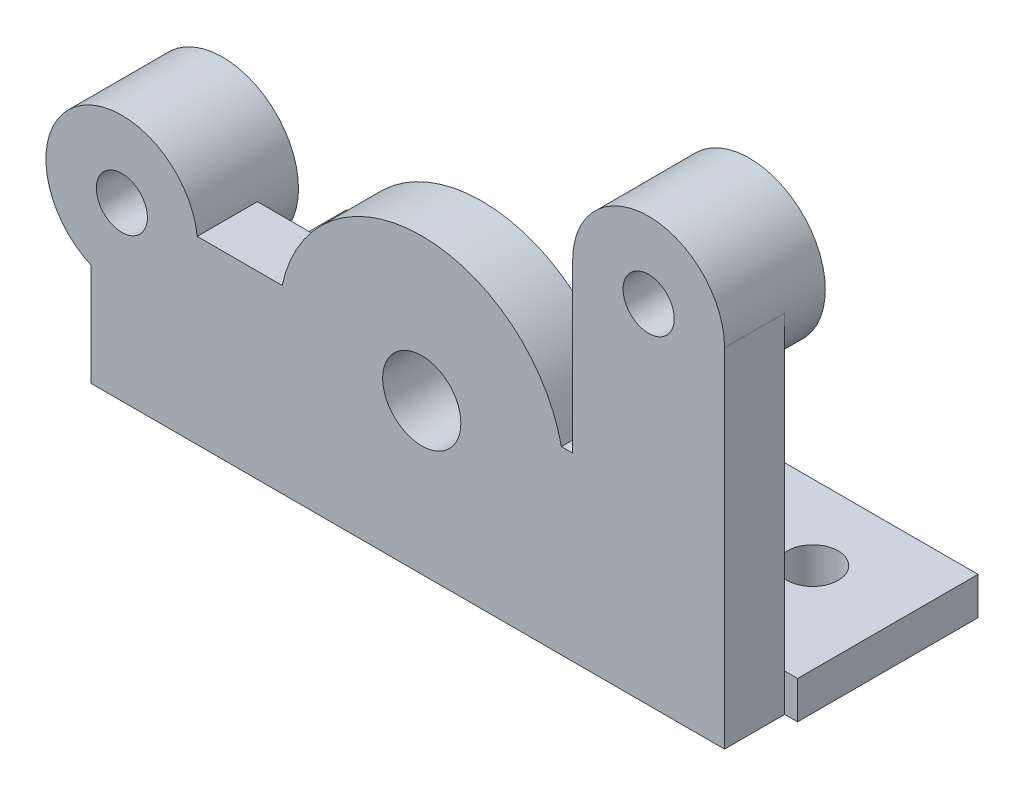
ISO-10303-21;
HEADER;
FILE_DESCRIPTION(('STEP AP214'),'2;1');
FILE_NAME('part.step','',(''),(''),'','','');
FILE_SCHEMA(('AUTOMOTIVE_DESIGN { 1 0 10303 214 1 1 1 1 }'));
ENDSEC;
DATA;
#1=APPLICATION_CONTEXT('core data for automotive mechanical design processes');
#2=APPLICATION_PROTOCOL_DEFINITION('international standard','automotive_design',2000,#1);
#3=PRODUCT_CONTEXT('',#1,'mechanical');
#4=PRODUCT('Part','Part','',(#3));
#5=PRODUCT_RELATED_PRODUCT_CATEGORY('part','',(#4));
#6=PRODUCT_DEFINITION_FORMATION('','',#4);
#7=PRODUCT_DEFINITION_CONTEXT('part definition',#1,'design');
#8=PRODUCT_DEFINITION('design','',#6,#7);
#9=PRODUCT_DEFINITION_SHAPE('','',#8);
#10=(LENGTH_UNIT() NAMED_UNIT(*) SI_UNIT(.MILLI.,.METRE.));
#11=(NAMED_UNIT(*) PLANE_ANGLE_UNIT() SI_UNIT($,.RADIAN.));
#12=(NAMED_UNIT(*) SI_UNIT($,.STERADIAN.) SOLID_ANGLE_UNIT());
#13=UNCERTAINTY_MEASURE_WITH_UNIT(LENGTH_MEASURE(1.E-05),#10,'distance_accuracy_value','');
#14=(GEOMETRIC_REPRESENTATION_CONTEXT(3) GLOBAL_UNCERTAINTY_ASSIGNED_CONTEXT((#13)) GLOBAL_UNIT_ASSIGNED_CONTEXT((#10,
#11,#12)) REPRESENTATION_CONTEXT('',''));
#15=CARTESIAN_POINT('',(0.,0.,0.));
#16=DIRECTION('',(0.,0.,1.));
#17=DIRECTION('',(1.,0.,0.));
#18=AXIS2_PLACEMENT_3D('',#15,#16,#17);
#19=CARTESIAN_POINT('',(315.090923202436,53.1249395007438,343.5));
#20=DIRECTION('',(0.,0.,1.));
#21=DIRECTION('',(1.,0.,0.));
#22=AXIS2_PLACEMENT_3D('',#19,#20,#21);
#23=PLANE('',#22);
#24=CARTESIAN_POINT('',(315.090923202436,53.1249395007438,343.5));
#25=DIRECTION('',(0.,0.,1.));
#26=DIRECTION('',(1.,0.,0.));
#27=AXIS2_PLACEMENT_3D('',#24,#25,#26);
#28=CIRCLE('',#27,5.05);
#29=CARTESIAN_POINT('',(310.040923202436,53.1249395007438,343.5));
#30=VERTEX_POINT('',#29);
#31=CARTESIAN_POINT('',(320.140923202436,53.1249395007438,343.5));
#32=VERTEX_POINT('',#31);
#33=EDGE_CURVE('E232',#30,#32,#28,.T.);
#34=ORIENTED_EDGE('',*,*,#33,.T.);
#35=DIRECTION('',(0.,1.,0.));
#36=VECTOR('',#35,1.);
#37=CARTESIAN_POINT('',(320.140923202436,30.,343.5));
#38=LINE('',#37,#36);
#39=CARTESIAN_POINT('',(320.140923202436,32.5,343.5));
#40=VERTEX_POINT('',#39);
#41=EDGE_CURVE('E210',#40,#32,#38,.T.);
#42=ORIENTED_EDGE('',*,*,#41,.F.);
#43=DIRECTION('',(1.,0.,0.));
#44=VECTOR('',#43,1.);
#45=CARTESIAN_POINT('',(321.,32.5,343.5));
#46=LINE('',#45,#44);
#47=CARTESIAN_POINT('',(279.,32.5,343.5));
#48=VERTEX_POINT('',#47);
#49=EDGE_CURVE('E265',#48,#40,#46,.T.);
#50=ORIENTED_EDGE('',*,*,#49,.F.);
#51=DIRECTION('',(0.,-1.,0.));
#52=VECTOR('',#51,1.);
#53=CARTESIAN_POINT('',(279.,32.5,343.5));
#54=LINE('',#53,#52);
#55=CARTESIAN_POINT('',(279.,30.,343.5));
#56=VERTEX_POINT('',#55);
#57=EDGE_CURVE('E241',#48,#56,#54,.T.);
#58=ORIENTED_EDGE('',*,*,#57,.T.);
#59=DIRECTION('',(1.,0.,0.));
#60=VECTOR('',#59,1.);
#61=CARTESIAN_POINT('',(310.040923202436,30.,343.5));
#62=LINE('',#61,#60);
#63=CARTESIAN_POINT('',(278.,30.,343.5));
#64=VERTEX_POINT('',#63);
#65=EDGE_CURVE('E207',#64,#56,#62,.T.);
#66=ORIENTED_EDGE('',*,*,#65,.F.);
#67=DIRECTION('',(0.,-1.,0.));
#68=VECTOR('',#67,1.);
#69=CARTESIAN_POINT('',(278.,42.,343.5));
#70=LINE('',#69,#68);
#71=CARTESIAN_POINT('',(278.,36.8075323812111,343.5));
#72=VERTEX_POINT('',#71);
#73=EDGE_CURVE('E144',#72,#64,#70,.T.);
#74=ORIENTED_EDGE('',*,*,#73,.F.);
#75=CARTESIAN_POINT('',(280.050647311647,41.4224371043051,343.5));
#76=DIRECTION('',(0.,0.,1.));
#77=DIRECTION('',(1.,0.,0.));
#78=AXIS2_PLACEMENT_3D('',#75,#76,#77);
#79=CIRCLE('',#78,5.05);
#80=CARTESIAN_POINT('',(285.067510983456,42.,343.5));
#81=VERTEX_POINT('',#80);
#82=EDGE_CURVE('E138',#72,#81,#79,.T.);
#83=ORIENTED_EDGE('',*,*,#82,.T.);
#84=DIRECTION('',(-1.,0.,0.));
#85=VECTOR('',#84,1.);
#86=CARTESIAN_POINT('',(319.,42.,343.5));
#87=LINE('',#86,#85);
#88=CARTESIAN_POINT('',(290.712912189497,42.,343.5));
#89=VERTEX_POINT('',#88);
#90=EDGE_CURVE('E142',#89,#81,#87,.T.);
#91=ORIENTED_EDGE('',*,*,#90,.F.);
#92=CARTESIAN_POINT('',(300.,40.,343.5));
#93=DIRECTION('',(0.,0.,1.));
#94=DIRECTION('',(1.,0.,0.));
#95=AXIS2_PLACEMENT_3D('',#92,#93,#94);
#96=CIRCLE('',#95,9.50000000000001);
#97=CARTESIAN_POINT('',(309.287087810503,42.,343.5));
#98=VERTEX_POINT('',#97);
#99=EDGE_CURVE('E176',#98,#89,#96,.T.);
#100=ORIENTED_EDGE('',*,*,#99,.F.);
#101=CARTESIAN_POINT('',(310.040923202436,42.,343.5));
#102=VERTEX_POINT('',#101);
#103=EDGE_CURVE('E159',#102,#98,#87,.T.);
#104=ORIENTED_EDGE('',*,*,#103,.F.);
#105=DIRECTION('',(0.,-1.,0.));
#106=VECTOR('',#105,1.);
#107=CARTESIAN_POINT('',(310.040923202436,53.1249395007438,343.5));
#108=LINE('',#107,#106);
#109=EDGE_CURVE('E196',#30,#102,#108,.T.);
#110=ORIENTED_EDGE('',*,*,#109,.F.);
#111=EDGE_LOOP('',(#34,#42,#50,#58,#66,#74,#83,#91,#100,#104,#110));
#112=FACE_BOUND('',#111,.T.);
#113=CARTESIAN_POINT('',(300.,40.,343.5));
#114=DIRECTION('',(0.,0.,1.));
#115=DIRECTION('',(1.,0.,0.));
#116=AXIS2_PLACEMENT_3D('',#113,#114,#115);
#117=CIRCLE('',#116,2.59999999999999);
#118=CARTESIAN_POINT('',(302.6,40.,343.5));
#119=VERTEX_POINT('',#118);
#120=EDGE_CURVE('E166',#119,#119,#117,.T.);
#121=ORIENTED_EDGE('',*,*,#120,.T.);
#122=EDGE_LOOP('',(#121));
#123=FACE_BOUND('',#122,.T.);
#124=ADVANCED_FACE('F39',(#112,#123),#23,.F.);
#125=CARTESIAN_POINT('',(310.040923202436,53.1249395007438,347.5));
#126=DIRECTION('',(1.,0.,0.));
#127=DIRECTION('',(0.,0.,-1.));
#128=AXIS2_PLACEMENT_3D('',#125,#126,#127);
#129=PLANE('',#128);
#130=DIRECTION('',(0.,0.,-1.));
#131=VECTOR('',#130,1.);
#132=CARTESIAN_POINT('',(310.040923202436,42.,347.5));
#133=LINE('',#132,#131);
#134=CARTESIAN_POINT('',(310.040923202436,42.,347.5));
#135=VERTEX_POINT('',#134);
#136=EDGE_CURVE('E11',#135,#102,#133,.T.);
#137=ORIENTED_EDGE('',*,*,#136,.F.);
#138=DIRECTION('',(0.,-1.,0.));
#139=VECTOR('',#138,1.);
#140=CARTESIAN_POINT('',(310.040923202436,53.1249395007438,347.5));
#141=LINE('',#140,#139);
#142=CARTESIAN_POINT('',(310.040923202436,53.1249395007438,347.5));
#143=VERTEX_POINT('',#142);
#144=EDGE_CURVE('E197',#143,#135,#141,.T.);
#145=ORIENTED_EDGE('',*,*,#144,.F.);
#146=DIRECTION('',(0.,0.,-1.));
#147=VECTOR('',#146,1.);
#148=CARTESIAN_POINT('',(310.040923202436,53.1249395007438,347.5));
#149=LINE('',#148,#147);
#150=EDGE_CURVE('E205',#143,#30,#149,.T.);
#151=ORIENTED_EDGE('',*,*,#150,.T.);
#152=ORIENTED_EDGE('',*,*,#109,.T.);
#153=EDGE_LOOP('',(#137,#145,#151,#152));
#154=FACE_BOUND('',#153,.T.);
#155=ADVANCED_FACE('F228',(#154),#129,.F.);
#156=CARTESIAN_POINT('',(315.090923202436,53.1249395007438,347.5));
#157=DIRECTION('',(0.,0.,-1.));
#158=DIRECTION('',(-1.,0.,0.));
#159=AXIS2_PLACEMENT_3D('',#156,#157,#158);
#160=CYLINDRICAL_SURFACE('',#159,5.05);
#161=ORIENTED_EDGE('',*,*,#150,.F.);
#162=CARTESIAN_POINT('',(315.090923202436,53.1249395007438,347.5));
#163=DIRECTION('',(0.,0.,1.));
#164=DIRECTION('',(1.,0.,0.));
#165=AXIS2_PLACEMENT_3D('',#162,#163,#164);
#166=CIRCLE('',#165,5.05);
#167=CARTESIAN_POINT('',(320.140923202436,53.1249395007438,347.5));
#168=VERTEX_POINT('',#167);
#169=EDGE_CURVE('E47',#168,#143,#166,.T.);
#170=ORIENTED_EDGE('',*,*,#169,.F.);
#171=DIRECTION('',(0.,0.,-1.));
#172=VECTOR('',#171,1.);
#173=CARTESIAN_POINT('',(320.140923202436,53.1249395007438,347.5));
#174=LINE('',#173,#172);
#175=EDGE_CURVE('E215',#168,#32,#174,.T.);
#176=ORIENTED_EDGE('',*,*,#175,.T.);
#177=ORIENTED_EDGE('',*,*,#33,.F.);
#178=EDGE_LOOP('',(#161,#170,#176,#177));
#179=FACE_BOUND('',#178,.T.);
#180=CARTESIAN_POINT('',(315.090923202436,53.1249395007438,340.8));
#181=DIRECTION('',(0.,0.,1.));
#182=DIRECTION('',(1.,0.,0.));
#183=AXIS2_PLACEMENT_3D('',#180,#181,#182);
#184=CIRCLE('',#183,5.05);
#185=CARTESIAN_POINT('',(320.140923202436,53.1249395007438,340.8));
#186=VERTEX_POINT('',#185);
#187=EDGE_CURVE('E283',#186,#186,#184,.T.);
#188=ORIENTED_EDGE('',*,*,#187,.T.);
#189=EDGE_LOOP('',(#188));
#190=FACE_BOUND('',#189,.T.);
#191=ADVANCED_FACE('F41',(#179,#190),#160,.T.);
#192=CARTESIAN_POINT('',(315.090923202436,53.1249395007438,347.5));
#193=DIRECTION('',(0.,0.,1.));
#194=DIRECTION('',(1.,0.,0.));
#195=AXIS2_PLACEMENT_3D('',#192,#193,#194);
#196=PLANE('',#195);
#197=CARTESIAN_POINT('',(315.090923202436,53.1249395007438,347.5));
#198=DIRECTION('',(0.,0.,1.));
#199=DIRECTION('',(1.,0.,0.));
#200=AXIS2_PLACEMENT_3D('',#197,#198,#199);
#201=CIRCLE('',#200,1.69999999999998);
#202=CARTESIAN_POINT('',(313.390923202436,53.1249395007438,347.5));
#203=VERTEX_POINT('',#202);
#204=EDGE_CURVE('E150',#203,#203,#201,.T.);
#205=ORIENTED_EDGE('',*,*,#204,.F.);
#206=EDGE_LOOP('',(#205));
#207=FACE_BOUND('',#206,.T.);
#208=CARTESIAN_POINT('',(280.050647311647,41.4224371043051,347.5));
#209=DIRECTION('',(0.,0.,1.));
#210=DIRECTION('',(1.,0.,0.));
#211=AXIS2_PLACEMENT_3D('',#208,#209,#210);
#212=CIRCLE('',#211,1.69999999999998);
#213=CARTESIAN_POINT('',(278.350647311647,41.4224371043051,347.5));
#214=VERTEX_POINT('',#213);
#215=EDGE_CURVE('E287',#214,#214,#212,.T.);
#216=ORIENTED_EDGE('',*,*,#215,.F.);
#217=EDGE_LOOP('',(#216));
#218=FACE_BOUND('',#217,.T.);
#219=ORIENTED_EDGE('',*,*,#144,.T.);
#220=DIRECTION('',(-1.,0.,0.));
#221=VECTOR('',#220,1.);
#222=CARTESIAN_POINT('',(319.,42.,347.5));
#223=LINE('',#222,#221);
#224=CARTESIAN_POINT('',(309.287087810503,42.,347.5));
#225=VERTEX_POINT('',#224);
#226=EDGE_CURVE('E190',#135,#225,#223,.T.);
#227=ORIENTED_EDGE('',*,*,#226,.T.);
#228=CARTESIAN_POINT('',(300.,40.,347.5));
#229=DIRECTION('',(0.,0.,1.));
#230=DIRECTION('',(1.,0.,0.));
#231=AXIS2_PLACEMENT_3D('',#228,#229,#230);
#232=CIRCLE('',#231,9.50000000000001);
#233=CARTESIAN_POINT('',(290.712912189497,42.,347.5));
#234=VERTEX_POINT('',#233);
#235=EDGE_CURVE('E178',#225,#234,#232,.T.);
#236=ORIENTED_EDGE('',*,*,#235,.T.);
#237=CARTESIAN_POINT('',(285.067510983456,42.,347.5));
#238=VERTEX_POINT('',#237);
#239=EDGE_CURVE('E189',#234,#238,#223,.T.);
#240=ORIENTED_EDGE('',*,*,#239,.T.);
#241=CARTESIAN_POINT('',(280.050647311647,41.4224371043051,347.5));
#242=DIRECTION('',(0.,0.,1.));
#243=DIRECTION('',(1.,0.,0.));
#244=AXIS2_PLACEMENT_3D('',#241,#242,#243);
#245=CIRCLE('',#244,5.05);
#246=CARTESIAN_POINT('',(278.,36.8075323812111,347.5));
#247=VERTEX_POINT('',#246);
#248=EDGE_CURVE('E165',#238,#247,#245,.T.);
#249=ORIENTED_EDGE('',*,*,#248,.T.);
#250=DIRECTION('',(0.,-1.,0.));
#251=VECTOR('',#250,1.);
#252=CARTESIAN_POINT('',(278.,42.,347.5));
#253=LINE('',#252,#251);
#254=CARTESIAN_POINT('',(278.,30.,347.5));
#255=VERTEX_POINT('',#254);
#256=EDGE_CURVE('E186',#247,#255,#253,.T.);
#257=ORIENTED_EDGE('',*,*,#256,.T.);
#258=DIRECTION('',(1.,0.,0.));
#259=VECTOR('',#258,1.);
#260=CARTESIAN_POINT('',(310.040923202436,30.,347.5));
#261=LINE('',#260,#259);
#262=CARTESIAN_POINT('',(320.140923202436,30.,347.5));
#263=VERTEX_POINT('',#262);
#264=EDGE_CURVE('E199',#255,#263,#261,.T.);
#265=ORIENTED_EDGE('',*,*,#264,.T.);
#266=DIRECTION('',(0.,1.,0.));
#267=VECTOR('',#266,1.);
#268=CARTESIAN_POINT('',(320.140923202436,30.,347.5));
#269=LINE('',#268,#267);
#270=EDGE_CURVE('E202',#263,#168,#269,.T.);
#271=ORIENTED_EDGE('',*,*,#270,.T.);
#272=ORIENTED_EDGE('',*,*,#169,.T.);
#273=EDGE_LOOP('',(#219,#227,#236,#240,#249,#257,#265,#271,#272));
#274=FACE_BOUND('',#273,.T.);
#275=CARTESIAN_POINT('',(300.,40.,347.5));
#276=DIRECTION('',(0.,0.,1.));
#277=DIRECTION('',(1.,0.,0.));
#278=AXIS2_PLACEMENT_3D('',#275,#276,#277);
#279=CIRCLE('',#278,2.59999999999999);
#280=CARTESIAN_POINT('',(302.6,40.,347.5));
#281=VERTEX_POINT('',#280);
#282=EDGE_CURVE('E170',#281,#281,#279,.T.);
#283=ORIENTED_EDGE('',*,*,#282,.F.);
#284=EDGE_LOOP('',(#283));
#285=FACE_BOUND('',#284,.T.);
#286=ADVANCED_FACE('F222',(#207,#218,#274,#285),#196,.T.);
#287=CARTESIAN_POINT('',(310.040923202436,30.,347.5));
#288=DIRECTION('',(0.,1.,0.));
#289=DIRECTION('',(0.,0.,1.));
#290=AXIS2_PLACEMENT_3D('',#287,#288,#289);
#291=PLANE('',#290);
#292=ORIENTED_EDGE('',*,*,#65,.T.);
#293=DIRECTION('',(0.,0.,1.));
#294=VECTOR('',#293,1.);
#295=CARTESIAN_POINT('',(279.,30.,343.5));
#296=LINE('',#295,#294);
#297=CARTESIAN_POINT('',(279.,30.,331.5));
#298=VERTEX_POINT('',#297);
#299=EDGE_CURVE('E54',#298,#56,#296,.T.);
#300=ORIENTED_EDGE('',*,*,#299,.F.);
#301=DIRECTION('',(-1.,0.,0.));
#302=VECTOR('',#301,1.);
#303=CARTESIAN_POINT('',(279.,30.,331.5));
#304=LINE('',#303,#302);
#305=CARTESIAN_POINT('',(321.,30.,331.5));
#306=VERTEX_POINT('',#305);
#307=EDGE_CURVE('E253',#306,#298,#304,.T.);
#308=ORIENTED_EDGE('',*,*,#307,.F.);
#309=DIRECTION('',(0.,0.,-1.));
#310=VECTOR('',#309,1.);
#311=CARTESIAN_POINT('',(321.,30.,331.5));
#312=LINE('',#311,#310);
#313=CARTESIAN_POINT('',(321.,30.,343.5));
#314=VERTEX_POINT('',#313);
#315=EDGE_CURVE('E256',#314,#306,#312,.T.);
#316=ORIENTED_EDGE('',*,*,#315,.F.);
#317=DIRECTION('',(1.,0.,0.));
#318=VECTOR('',#317,1.);
#319=CARTESIAN_POINT('',(321.,30.,343.5));
#320=LINE('',#319,#318);
#321=CARTESIAN_POINT('',(320.140923202436,30.,343.5));
#322=VERTEX_POINT('',#321);
#323=EDGE_CURVE('E258',#322,#314,#320,.T.);
#324=ORIENTED_EDGE('',*,*,#323,.F.);
#325=DIRECTION('',(0.,0.,-1.));
#326=VECTOR('',#325,1.);
#327=CARTESIAN_POINT('',(320.140923202436,30.,347.5));
#328=LINE('',#327,#326);
#329=EDGE_CURVE('E218',#263,#322,#328,.T.);
#330=ORIENTED_EDGE('',*,*,#329,.F.);
#331=ORIENTED_EDGE('',*,*,#264,.F.);
#332=DIRECTION('',(0.,0.,-1.));
#333=VECTOR('',#332,1.);
#334=CARTESIAN_POINT('',(278.,30.,347.5));
#335=LINE('',#334,#333);
#336=EDGE_CURVE('E192',#255,#64,#335,.T.);
#337=ORIENTED_EDGE('',*,*,#336,.T.);
#338=EDGE_LOOP('',(#292,#300,#308,#316,#324,#330,#331,#337));
#339=FACE_BOUND('',#338,.T.);
#340=CARTESIAN_POINT('',(285.,30.,336.5));
#341=DIRECTION('',(0.,1.,0.));
#342=DIRECTION('',(0.,0.,1.));
#343=AXIS2_PLACEMENT_3D('',#340,#341,#342);
#344=CIRCLE('',#343,1.69999999999998);
#345=CARTESIAN_POINT('',(285.,30.,338.2));
#346=VERTEX_POINT('',#345);
#347=EDGE_CURVE('E270',#346,#346,#344,.T.);
#348=ORIENTED_EDGE('',*,*,#347,.T.);
#349=EDGE_LOOP('',(#348));
#350=FACE_BOUND('',#349,.T.);
#351=CARTESIAN_POINT('',(315.,30.,336.5));
#352=DIRECTION('',(0.,1.,0.));
#353=DIRECTION('',(0.,0.,1.));
#354=AXIS2_PLACEMENT_3D('',#351,#352,#353);
#355=CIRCLE('',#354,1.69999999999998);
#356=CARTESIAN_POINT('',(315.,30.,338.2));
#357=VERTEX_POINT('',#356);
#358=EDGE_CURVE('E276',#357,#357,#355,.T.);
#359=ORIENTED_EDGE('',*,*,#358,.T.);
#360=EDGE_LOOP('',(#359));
#361=FACE_BOUND('',#360,.T.);
#362=ADVANCED_FACE('F304',(#339,#350,#361),#291,.F.);
#363=CARTESIAN_POINT('',(320.140923202436,30.,347.5));
#364=DIRECTION('',(-1.,0.,0.));
#365=DIRECTION('',(0.,0.,1.));
#366=AXIS2_PLACEMENT_3D('',#363,#364,#365);
#367=PLANE('',#366);
#368=EDGE_CURVE('E200',#322,#40,#38,.T.);
#369=ORIENTED_EDGE('',*,*,#368,.T.);
#370=ORIENTED_EDGE('',*,*,#41,.T.);
#371=ORIENTED_EDGE('',*,*,#175,.F.);
#372=ORIENTED_EDGE('',*,*,#270,.F.);
#373=ORIENTED_EDGE('',*,*,#329,.T.);
#374=EDGE_LOOP('',(#369,#370,#371,#372,#373));
#375=FACE_BOUND('',#374,.T.);
#376=ADVANCED_FACE('F344',(#375),#367,.F.);
#377=CARTESIAN_POINT('',(319.,42.,347.5));
#378=DIRECTION('',(0.,-1.,0.));
#379=DIRECTION('',(0.,0.,-1.));
#380=AXIS2_PLACEMENT_3D('',#377,#378,#379);
#381=PLANE('',#380);
#382=ORIENTED_EDGE('',*,*,#226,.F.);
#383=ORIENTED_EDGE('',*,*,#136,.T.);
#384=ORIENTED_EDGE('',*,*,#103,.T.);
#385=DIRECTION('',(0.,0.,-1.));
#386=VECTOR('',#385,1.);
#387=CARTESIAN_POINT('',(309.287087810503,42.,347.5));
#388=LINE('',#387,#386);
#389=EDGE_CURVE('E181',#225,#98,#388,.T.);
#390=ORIENTED_EDGE('',*,*,#389,.F.);
#391=EDGE_LOOP('',(#382,#383,#384,#390));
#392=FACE_BOUND('',#391,.T.);
#393=ADVANCED_FACE('F236',(#392),#381,.F.);
#394=DIRECTION('',(0.,0.,-1.));
#395=VECTOR('',#394,1.);
#396=CARTESIAN_POINT('',(285.067510983456,42.,347.5));
#397=LINE('',#396,#395);
#398=EDGE_CURVE('E156',#238,#81,#397,.T.);
#399=ORIENTED_EDGE('',*,*,#398,.F.);
#400=ORIENTED_EDGE('',*,*,#239,.F.);
#401=DIRECTION('',(0.,0.,-1.));
#402=VECTOR('',#401,1.);
#403=CARTESIAN_POINT('',(290.712912189497,42.,347.5));
#404=LINE('',#403,#402);
#405=EDGE_CURVE('E158',#89,#234,#404,.F.);
#406=ORIENTED_EDGE('',*,*,#405,.F.);
#407=ORIENTED_EDGE('',*,*,#90,.T.);
#408=EDGE_LOOP('',(#399,#400,#406,#407));
#409=FACE_BOUND('',#408,.T.);
#410=ADVANCED_FACE('F154',(#409),#381,.F.);
#411=CARTESIAN_POINT('',(278.,42.,347.5));
#412=DIRECTION('',(1.,0.,0.));
#413=DIRECTION('',(0.,0.,-1.));
#414=AXIS2_PLACEMENT_3D('',#411,#412,#413);
#415=PLANE('',#414);
#416=DIRECTION('',(0.,0.,-1.));
#417=VECTOR('',#416,1.);
#418=CARTESIAN_POINT('',(278.,36.8075323812111,347.5));
#419=LINE('',#418,#417);
#420=EDGE_CURVE('E167',#72,#247,#419,.F.);
#421=ORIENTED_EDGE('',*,*,#420,.F.);
#422=ORIENTED_EDGE('',*,*,#73,.T.);
#423=ORIENTED_EDGE('',*,*,#336,.F.);
#424=ORIENTED_EDGE('',*,*,#256,.F.);
#425=EDGE_LOOP('',(#421,#422,#423,#424));
#426=FACE_BOUND('',#425,.T.);
#427=ADVANCED_FACE('F349',(#426),#415,.F.);
#428=CARTESIAN_POINT('',(300.,40.,347.5));
#429=DIRECTION('',(0.,0.,-1.));
#430=DIRECTION('',(-1.,0.,0.));
#431=AXIS2_PLACEMENT_3D('',#428,#429,#430);
#432=CYLINDRICAL_SURFACE('',#431,9.50000000000001);
#433=ORIENTED_EDGE('',*,*,#99,.T.);
#434=ORIENTED_EDGE('',*,*,#405,.T.);
#435=ORIENTED_EDGE('',*,*,#235,.F.);
#436=ORIENTED_EDGE('',*,*,#389,.T.);
#437=EDGE_LOOP('',(#433,#434,#435,#436));
#438=FACE_BOUND('',#437,.T.);
#439=ADVANCED_FACE('F239',(#438),#432,.T.);
#440=CARTESIAN_POINT('',(300.,40.,347.5));
#441=DIRECTION('',(0.,0.,-1.));
#442=DIRECTION('',(-1.,0.,0.));
#443=AXIS2_PLACEMENT_3D('',#440,#441,#442);
#444=CYLINDRICAL_SURFACE('',#443,2.59999999999999);
#445=ORIENTED_EDGE('',*,*,#282,.T.);
#446=EDGE_LOOP('',(#445));
#447=FACE_BOUND('',#446,.T.);
#448=ORIENTED_EDGE('',*,*,#120,.F.);
#449=EDGE_LOOP('',(#448));
#450=FACE_BOUND('',#449,.T.);
#451=ADVANCED_FACE('F323',(#447,#450),#444,.F.);
#452=CARTESIAN_POINT('',(280.050647311647,41.4224371043051,347.5));
#453=DIRECTION('',(0.,0.,-1.));
#454=DIRECTION('',(-1.,0.,0.));
#455=AXIS2_PLACEMENT_3D('',#452,#453,#454);
#456=CYLINDRICAL_SURFACE('',#455,5.05);
#457=ORIENTED_EDGE('',*,*,#248,.F.);
#458=ORIENTED_EDGE('',*,*,#398,.T.);
#459=ORIENTED_EDGE('',*,*,#82,.F.);
#460=ORIENTED_EDGE('',*,*,#420,.T.);
#461=EDGE_LOOP('',(#457,#458,#459,#460));
#462=FACE_BOUND('',#461,.T.);
#463=CARTESIAN_POINT('',(280.050647311647,41.4224371043051,340.8));
#464=DIRECTION('',(0.,0.,1.));
#465=DIRECTION('',(1.,0.,0.));
#466=AXIS2_PLACEMENT_3D('',#463,#464,#465);
#467=CIRCLE('',#466,5.05);
#468=CARTESIAN_POINT('',(285.100647311647,41.4224371043051,340.8));
#469=VERTEX_POINT('',#468);
#470=EDGE_CURVE('E149',#469,#469,#467,.T.);
#471=ORIENTED_EDGE('',*,*,#470,.T.);
#472=EDGE_LOOP('',(#471));
#473=FACE_BOUND('',#472,.T.);
#474=ADVANCED_FACE('F162',(#462,#473),#456,.T.);
#475=CARTESIAN_POINT('',(0.,32.5,0.));
#476=DIRECTION('',(0.,-1.,0.));
#477=DIRECTION('',(0.,0.,-1.));
#478=AXIS2_PLACEMENT_3D('',#475,#476,#477);
#479=PLANE('',#478);
#480=DIRECTION('',(0.,0.,1.));
#481=VECTOR('',#480,1.);
#482=CARTESIAN_POINT('',(279.,32.5,343.5));
#483=LINE('',#482,#481);
#484=CARTESIAN_POINT('',(279.,32.5,331.5));
#485=VERTEX_POINT('',#484);
#486=EDGE_CURVE('E255',#485,#48,#483,.T.);
#487=ORIENTED_EDGE('',*,*,#486,.T.);
#488=ORIENTED_EDGE('',*,*,#49,.T.);
#489=CARTESIAN_POINT('',(321.,32.5,343.5));
#490=VERTEX_POINT('',#489);
#491=EDGE_CURVE('E268',#40,#490,#46,.T.);
#492=ORIENTED_EDGE('',*,*,#491,.T.);
#493=DIRECTION('',(0.,0.,-1.));
#494=VECTOR('',#493,1.);
#495=CARTESIAN_POINT('',(321.,32.5,331.5));
#496=LINE('',#495,#494);
#497=CARTESIAN_POINT('',(321.,32.5,331.5));
#498=VERTEX_POINT('',#497);
#499=EDGE_CURVE('E263',#490,#498,#496,.T.);
#500=ORIENTED_EDGE('',*,*,#499,.T.);
#501=DIRECTION('',(-1.,0.,0.));
#502=VECTOR('',#501,1.);
#503=CARTESIAN_POINT('',(279.,32.5,331.5));
#504=LINE('',#503,#502);
#505=EDGE_CURVE('E252',#498,#485,#504,.T.);
#506=ORIENTED_EDGE('',*,*,#505,.T.);
#507=EDGE_LOOP('',(#487,#488,#492,#500,#506));
#508=FACE_BOUND('',#507,.T.);
#509=CARTESIAN_POINT('',(285.,32.5,336.5));
#510=DIRECTION('',(0.,1.,0.));
#511=DIRECTION('',(0.,0.,1.));
#512=AXIS2_PLACEMENT_3D('',#509,#510,#511);
#513=CIRCLE('',#512,1.69999999999998);
#514=CARTESIAN_POINT('',(285.,32.5,338.2));
#515=VERTEX_POINT('',#514);
#516=EDGE_CURVE('E261',#515,#515,#513,.T.);
#517=ORIENTED_EDGE('',*,*,#516,.F.);
#518=EDGE_LOOP('',(#517));
#519=FACE_BOUND('',#518,.T.);
#520=CARTESIAN_POINT('',(315.,32.5,336.5));
#521=DIRECTION('',(0.,1.,0.));
#522=DIRECTION('',(0.,0.,1.));
#523=AXIS2_PLACEMENT_3D('',#520,#521,#522);
#524=CIRCLE('',#523,1.69999999999998);
#525=CARTESIAN_POINT('',(315.,32.5,338.2));
#526=VERTEX_POINT('',#525);
#527=EDGE_CURVE('E273',#526,#526,#524,.T.);
#528=ORIENTED_EDGE('',*,*,#527,.F.);
#529=EDGE_LOOP('',(#528));
#530=FACE_BOUND('',#529,.T.);
#531=ADVANCED_FACE('F322',(#508,#519,#530),#479,.F.);
#532=CARTESIAN_POINT('',(279.,32.5,343.5));
#533=DIRECTION('',(1.,0.,0.));
#534=DIRECTION('',(0.,0.,-1.));
#535=AXIS2_PLACEMENT_3D('',#532,#533,#534);
#536=PLANE('',#535);
#537=ORIENTED_EDGE('',*,*,#299,.T.);
#538=ORIENTED_EDGE('',*,*,#57,.F.);
#539=ORIENTED_EDGE('',*,*,#486,.F.);
#540=DIRECTION('',(0.,-1.,0.));
#541=VECTOR('',#540,1.);
#542=CARTESIAN_POINT('',(279.,32.5,331.5));
#543=LINE('',#542,#541);
#544=EDGE_CURVE('E250',#485,#298,#543,.T.);
#545=ORIENTED_EDGE('',*,*,#544,.T.);
#546=EDGE_LOOP('',(#537,#538,#539,#545));
#547=FACE_BOUND('',#546,.T.);
#548=ADVANCED_FACE('F329',(#547),#536,.F.);
#549=CARTESIAN_POINT('',(321.,32.5,343.5));
#550=DIRECTION('',(0.,0.,-1.));
#551=DIRECTION('',(-1.,0.,0.));
#552=AXIS2_PLACEMENT_3D('',#549,#550,#551);
#553=PLANE('',#552);
#554=ORIENTED_EDGE('',*,*,#368,.F.);
#555=ORIENTED_EDGE('',*,*,#323,.T.);
#556=DIRECTION('',(0.,-1.,0.));
#557=VECTOR('',#556,1.);
#558=CARTESIAN_POINT('',(321.,32.5,343.5));
#559=LINE('',#558,#557);
#560=EDGE_CURVE('E242',#490,#314,#559,.T.);
#561=ORIENTED_EDGE('',*,*,#560,.F.);
#562=ORIENTED_EDGE('',*,*,#491,.F.);
#563=EDGE_LOOP('',(#554,#555,#561,#562));
#564=FACE_BOUND('',#563,.T.);
#565=ADVANCED_FACE('F378',(#564),#553,.F.);
#566=CARTESIAN_POINT('',(321.,32.5,331.5));
#567=DIRECTION('',(-1.,0.,0.));
#568=DIRECTION('',(0.,0.,1.));
#569=AXIS2_PLACEMENT_3D('',#566,#567,#568);
#570=PLANE('',#569);
#571=ORIENTED_EDGE('',*,*,#315,.T.);
#572=DIRECTION('',(0.,-1.,0.));
#573=VECTOR('',#572,1.);
#574=CARTESIAN_POINT('',(321.,32.5,331.5));
#575=LINE('',#574,#573);
#576=EDGE_CURVE('E247',#498,#306,#575,.T.);
#577=ORIENTED_EDGE('',*,*,#576,.F.);
#578=ORIENTED_EDGE('',*,*,#499,.F.);
#579=ORIENTED_EDGE('',*,*,#560,.T.);
#580=EDGE_LOOP('',(#571,#577,#578,#579));
#581=FACE_BOUND('',#580,.T.);
#582=ADVANCED_FACE('F385',(#581),#570,.F.);
#583=CARTESIAN_POINT('',(279.,32.5,331.5));
#584=DIRECTION('',(0.,0.,1.));
#585=DIRECTION('',(1.,0.,0.));
#586=AXIS2_PLACEMENT_3D('',#583,#584,#585);
#587=PLANE('',#586);
#588=ORIENTED_EDGE('',*,*,#307,.T.);
#589=ORIENTED_EDGE('',*,*,#544,.F.);
#590=ORIENTED_EDGE('',*,*,#505,.F.);
#591=ORIENTED_EDGE('',*,*,#576,.T.);
#592=EDGE_LOOP('',(#588,#589,#590,#591));
#593=FACE_BOUND('',#592,.T.);
#594=ADVANCED_FACE('F394',(#593),#587,.F.);
#595=CARTESIAN_POINT('',(285.,32.5,336.5));
#596=DIRECTION('',(0.,-1.,0.));
#597=DIRECTION('',(0.,0.,-1.));
#598=AXIS2_PLACEMENT_3D('',#595,#596,#597);
#599=CYLINDRICAL_SURFACE('',#598,1.69999999999998);
#600=ORIENTED_EDGE('',*,*,#516,.T.);
#601=EDGE_LOOP('',(#600));
#602=FACE_BOUND('',#601,.T.);
#603=ORIENTED_EDGE('',*,*,#347,.F.);
#604=EDGE_LOOP('',(#603));
#605=FACE_BOUND('',#604,.T.);
#606=ADVANCED_FACE('F403',(#602,#605),#599,.F.);
#607=CARTESIAN_POINT('',(315.,32.5,336.5));
#608=DIRECTION('',(0.,-1.,0.));
#609=DIRECTION('',(0.,0.,-1.));
#610=AXIS2_PLACEMENT_3D('',#607,#608,#609);
#611=CYLINDRICAL_SURFACE('',#610,1.69999999999998);
#612=ORIENTED_EDGE('',*,*,#527,.T.);
#613=EDGE_LOOP('',(#612));
#614=FACE_BOUND('',#613,.T.);
#615=ORIENTED_EDGE('',*,*,#358,.F.);
#616=EDGE_LOOP('',(#615));
#617=FACE_BOUND('',#616,.T.);
#618=ADVANCED_FACE('F318',(#614,#617),#611,.F.);
#619=CARTESIAN_POINT('',(280.050647311647,41.4224371043051,340.8));
#620=DIRECTION('',(0.,0.,1.));
#621=DIRECTION('',(1.,0.,0.));
#622=AXIS2_PLACEMENT_3D('',#619,#620,#621);
#623=PLANE('',#622);
#624=CARTESIAN_POINT('',(280.050647311647,41.4224371043051,340.8));
#625=DIRECTION('',(0.,0.,1.));
#626=DIRECTION('',(1.,0.,0.));
#627=AXIS2_PLACEMENT_3D('',#624,#625,#626);
#628=CIRCLE('',#627,1.69999999999998);
#629=CARTESIAN_POINT('',(278.350647311647,41.4224371043051,340.8));
#630=VERTEX_POINT('',#629);
#631=EDGE_CURVE('E290',#630,#630,#628,.T.);
#632=ORIENTED_EDGE('',*,*,#631,.T.);
#633=EDGE_LOOP('',(#632));
#634=FACE_BOUND('',#633,.T.);
#635=ORIENTED_EDGE('',*,*,#470,.F.);
#636=EDGE_LOOP('',(#635));
#637=FACE_BOUND('',#636,.T.);
#638=ADVANCED_FACE('F314',(#634,#637),#623,.F.);
#639=CARTESIAN_POINT('',(315.090923202436,53.1249395007438,340.8));
#640=DIRECTION('',(0.,0.,1.));
#641=DIRECTION('',(1.,0.,0.));
#642=AXIS2_PLACEMENT_3D('',#639,#640,#641);
#643=PLANE('',#642);
#644=CARTESIAN_POINT('',(315.090923202436,53.1249395007438,340.8));
#645=DIRECTION('',(0.,0.,1.));
#646=DIRECTION('',(1.,0.,0.));
#647=AXIS2_PLACEMENT_3D('',#644,#645,#646);
#648=CIRCLE('',#647,1.69999999999998);
#649=CARTESIAN_POINT('',(313.390923202436,53.1249395007438,340.8));
#650=VERTEX_POINT('',#649);
#651=EDGE_CURVE('E293',#650,#650,#648,.T.);
#652=ORIENTED_EDGE('',*,*,#651,.T.);
#653=EDGE_LOOP('',(#652));
#654=FACE_BOUND('',#653,.T.);
#655=ORIENTED_EDGE('',*,*,#187,.F.);
#656=EDGE_LOOP('',(#655));
#657=FACE_BOUND('',#656,.T.);
#658=ADVANCED_FACE('F317',(#654,#657),#643,.F.);
#659=CARTESIAN_POINT('',(315.090923202436,53.1249395007438,347.5));
#660=DIRECTION('',(0.,0.,-1.));
#661=DIRECTION('',(-1.,0.,0.));
#662=AXIS2_PLACEMENT_3D('',#659,#660,#661);
#663=CYLINDRICAL_SURFACE('',#662,1.69999999999998);
#664=CARTESIAN_POINT('',(313.390923202436,53.1249395007438,347.5));
#665=CARTESIAN_POINT('',(313.390923202436,53.1249395007438,347.430208333333));
#666=CARTESIAN_POINT('',(313.390923202436,53.1249395007438,347.360416666667));
#667=CARTESIAN_POINT('',(313.390923202436,53.1249395007438,347.220833333333));
#668=CARTESIAN_POINT('',(313.390923202436,53.1249395007438,347.151041666667));
#669=CARTESIAN_POINT('',(313.390923202436,53.1249395007438,347.011458333333));
#670=CARTESIAN_POINT('',(313.390923202436,53.1249395007438,346.941666666667));
#671=CARTESIAN_POINT('',(313.390923202436,53.1249395007438,346.802083333333));
#672=CARTESIAN_POINT('',(313.390923202436,53.1249395007438,346.732291666667));
#673=CARTESIAN_POINT('',(313.390923202436,53.1249395007438,346.592708333333));
#674=CARTESIAN_POINT('',(313.390923202436,53.1249395007438,346.522916666667));
#675=CARTESIAN_POINT('',(313.390923202436,53.1249395007438,346.383333333333));
#676=CARTESIAN_POINT('',(313.390923202436,53.1249395007438,346.313541666667));
#677=CARTESIAN_POINT('',(313.390923202436,53.1249395007438,346.173958333333));
#678=CARTESIAN_POINT('',(313.390923202436,53.1249395007438,346.104166666667));
#679=CARTESIAN_POINT('',(313.390923202436,53.1249395007438,345.964583333333));
#680=CARTESIAN_POINT('',(313.390923202436,53.1249395007438,345.894791666667));
#681=CARTESIAN_POINT('',(313.390923202436,53.1249395007438,345.755208333333));
#682=CARTESIAN_POINT('',(313.390923202436,53.1249395007438,345.685416666667));
#683=CARTESIAN_POINT('',(313.390923202436,53.1249395007438,345.545833333333));
#684=CARTESIAN_POINT('',(313.390923202436,53.1249395007438,345.476041666667));
#685=CARTESIAN_POINT('',(313.390923202436,53.1249395007438,345.336458333333));
#686=CARTESIAN_POINT('',(313.390923202436,53.1249395007438,345.266666666667));
#687=CARTESIAN_POINT('',(313.390923202436,53.1249395007438,345.127083333333));
#688=CARTESIAN_POINT('',(313.390923202436,53.1249395007438,345.057291666667));
#689=CARTESIAN_POINT('',(313.390923202436,53.1249395007438,344.917708333333));
#690=CARTESIAN_POINT('',(313.390923202436,53.1249395007438,344.847916666667));
#691=CARTESIAN_POINT('',(313.390923202436,53.1249395007438,344.708333333333));
#692=CARTESIAN_POINT('',(313.390923202436,53.1249395007438,344.638541666667));
#693=CARTESIAN_POINT('',(313.390923202436,53.1249395007438,344.498958333333));
#694=CARTESIAN_POINT('',(313.390923202436,53.1249395007438,344.429166666667));
#695=CARTESIAN_POINT('',(313.390923202436,53.1249395007438,344.289583333333));
#696=CARTESIAN_POINT('',(313.390923202436,53.1249395007438,344.219791666667));
#697=CARTESIAN_POINT('',(313.390923202436,53.1249395007438,344.080208333333));
#698=CARTESIAN_POINT('',(313.390923202436,53.1249395007438,344.010416666667));
#699=CARTESIAN_POINT('',(313.390923202436,53.1249395007438,343.870833333333));
#700=CARTESIAN_POINT('',(313.390923202436,53.1249395007438,343.801041666667));
#701=CARTESIAN_POINT('',(313.390923202436,53.1249395007438,343.661458333333));
#702=CARTESIAN_POINT('',(313.390923202436,53.1249395007438,343.591666666667));
#703=CARTESIAN_POINT('',(313.390923202436,53.1249395007438,343.452083333333));
#704=CARTESIAN_POINT('',(313.390923202436,53.1249395007438,343.382291666667));
#705=CARTESIAN_POINT('',(313.390923202436,53.1249395007438,343.242708333333));
#706=CARTESIAN_POINT('',(313.390923202436,53.1249395007438,343.172916666667));
#707=CARTESIAN_POINT('',(313.390923202436,53.1249395007438,343.033333333333));
#708=CARTESIAN_POINT('',(313.390923202436,53.1249395007438,342.963541666667));
#709=CARTESIAN_POINT('',(313.390923202436,53.1249395007438,342.823958333333));
#710=CARTESIAN_POINT('',(313.390923202436,53.1249395007438,342.754166666667));
#711=CARTESIAN_POINT('',(313.390923202436,53.1249395007438,342.614583333333));
#712=CARTESIAN_POINT('',(313.390923202436,53.1249395007438,342.544791666667));
#713=CARTESIAN_POINT('',(313.390923202436,53.1249395007438,342.405208333333));
#714=CARTESIAN_POINT('',(313.390923202436,53.1249395007438,342.335416666667));
#715=CARTESIAN_POINT('',(313.390923202436,53.1249395007438,342.195833333333));
#716=CARTESIAN_POINT('',(313.390923202436,53.1249395007438,342.126041666667));
#717=CARTESIAN_POINT('',(313.390923202436,53.1249395007438,341.986458333333));
#718=CARTESIAN_POINT('',(313.390923202436,53.1249395007438,341.916666666667));
#719=CARTESIAN_POINT('',(313.390923202436,53.1249395007438,341.777083333333));
#720=CARTESIAN_POINT('',(313.390923202436,53.1249395007438,341.707291666667));
#721=CARTESIAN_POINT('',(313.390923202436,53.1249395007438,341.567708333333));
#722=CARTESIAN_POINT('',(313.390923202436,53.1249395007438,341.497916666667));
#723=CARTESIAN_POINT('',(313.390923202436,53.1249395007438,341.358333333333));
#724=CARTESIAN_POINT('',(313.390923202436,53.1249395007438,341.288541666667));
#725=CARTESIAN_POINT('',(313.390923202436,53.1249395007438,341.148958333333));
#726=CARTESIAN_POINT('',(313.390923202436,53.1249395007438,341.079166666667));
#727=CARTESIAN_POINT('',(313.390923202436,53.1249395007438,340.939583333333));
#728=CARTESIAN_POINT('',(313.390923202436,53.1249395007438,340.869791666667));
#729=CARTESIAN_POINT('',(313.390923202436,53.1249395007438,340.8));
#730=B_SPLINE_CURVE_WITH_KNOTS('',3,(#664,#665,#666,#667,#668,#669,#670,#671,#672,#673,#674,
#675,#676,#677,#678,#679,#680,#681,#682,#683,#684,#685,#686,#687,#688,#689,#690,#691,#692,#693,
#694,#695,#696,#697,#698,#699,#700,#701,#702,#703,#704,#705,#706,#707,#708,#709,#710,#711,#712,
#713,#714,#715,#716,#717,#718,#719,#720,#721,#722,#723,#724,#725,#726,#727,#728,#729),
.UNSPECIFIED.,.F.,.F.,(4,2,2,2,2,2,2,2,2,2,2,2,2,2,2,2,2,2,2,2,2,2,2,2,2,2,2,2,2,2,2,2,4),(0.,
0.209374999999956,0.418749999999968,0.628124999999979,0.837499999999991,1.04687499999995,
1.25624999999996,1.46562499999997,1.67499999999998,1.88437499999999,2.09374999999995,
2.30312499999996,2.51249999999997,2.72187499999998,2.93124999999994,3.14062499999995,
3.34999999999996,3.55937499999998,3.76874999999999,3.97812499999994,4.18749999999996,
4.39687499999997,4.60624999999998,4.81562499999993,5.02499999999995,5.23437499999996,
5.44374999999997,5.65312499999998,5.86249999999994,6.07187499999995,6.28124999999996,
6.49062499999997,6.69999999999998),.UNSPECIFIED.);
#731=EDGE_CURVE('BSEAM299',#203,#650,#730,.T.);
#732=ORIENTED_EDGE('',*,*,#204,.T.);
#733=ORIENTED_EDGE('',*,*,#651,.F.);
#734=ORIENTED_EDGE('',*,*,#731,.T.);
#735=ORIENTED_EDGE('',*,*,#731,.F.);
#736=EDGE_LOOP('',(#732,#734,#733,#735));
#737=FACE_BOUND('',#736,.T.);
#738=ADVANCED_FACE('F299',(#737),#663,.F.);
#739=CARTESIAN_POINT('',(280.050647311647,41.4224371043051,347.5));
#740=DIRECTION('',(0.,0.,-1.));
#741=DIRECTION('',(-1.,0.,0.));
#742=AXIS2_PLACEMENT_3D('',#739,#740,#741);
#743=CYLINDRICAL_SURFACE('',#742,1.69999999999998);
#744=CARTESIAN_POINT('',(278.350647311647,41.4224371043051,347.5));
#745=CARTESIAN_POINT('',(278.350647311647,41.4224371043051,347.430208333333));
#746=CARTESIAN_POINT('',(278.350647311647,41.4224371043051,347.360416666667));
#747=CARTESIAN_POINT('',(278.350647311647,41.4224371043051,347.220833333333));
#748=CARTESIAN_POINT('',(278.350647311647,41.4224371043051,347.151041666667));
#749=CARTESIAN_POINT('',(278.350647311647,41.4224371043051,347.011458333333));
#750=CARTESIAN_POINT('',(278.350647311647,41.4224371043051,346.941666666667));
#751=CARTESIAN_POINT('',(278.350647311647,41.4224371043051,346.802083333333));
#752=CARTESIAN_POINT('',(278.350647311647,41.4224371043051,346.732291666667));
#753=CARTESIAN_POINT('',(278.350647311647,41.4224371043051,346.592708333333));
#754=CARTESIAN_POINT('',(278.350647311647,41.4224371043051,346.522916666667));
#755=CARTESIAN_POINT('',(278.350647311647,41.4224371043051,346.383333333333));
#756=CARTESIAN_POINT('',(278.350647311647,41.4224371043051,346.313541666667));
#757=CARTESIAN_POINT('',(278.350647311647,41.4224371043051,346.173958333333));
#758=CARTESIAN_POINT('',(278.350647311647,41.4224371043051,346.104166666667));
#759=CARTESIAN_POINT('',(278.350647311647,41.4224371043051,345.964583333333));
#760=CARTESIAN_POINT('',(278.350647311647,41.4224371043051,345.894791666667));
#761=CARTESIAN_POINT('',(278.350647311647,41.4224371043051,345.755208333333));
#762=CARTESIAN_POINT('',(278.350647311647,41.4224371043051,345.685416666667));
#763=CARTESIAN_POINT('',(278.350647311647,41.4224371043051,345.545833333333));
#764=CARTESIAN_POINT('',(278.350647311647,41.4224371043051,345.476041666667));
#765=CARTESIAN_POINT('',(278.350647311647,41.4224371043051,345.336458333333));
#766=CARTESIAN_POINT('',(278.350647311647,41.4224371043051,345.266666666667));
#767=CARTESIAN_POINT('',(278.350647311647,41.4224371043051,345.127083333333));
#768=CARTESIAN_POINT('',(278.350647311647,41.4224371043051,345.057291666667));
#769=CARTESIAN_POINT('',(278.350647311647,41.4224371043051,344.917708333333));
#770=CARTESIAN_POINT('',(278.350647311647,41.4224371043051,344.847916666667));
#771=CARTESIAN_POINT('',(278.350647311647,41.4224371043051,344.708333333333));
#772=CARTESIAN_POINT('',(278.350647311647,41.4224371043051,344.638541666667));
#773=CARTESIAN_POINT('',(278.350647311647,41.4224371043051,344.498958333333));
#774=CARTESIAN_POINT('',(278.350647311647,41.4224371043051,344.429166666667));
#775=CARTESIAN_POINT('',(278.350647311647,41.4224371043051,344.289583333333));
#776=CARTESIAN_POINT('',(278.350647311647,41.4224371043051,344.219791666667));
#777=CARTESIAN_POINT('',(278.350647311647,41.4224371043051,344.080208333333));
#778=CARTESIAN_POINT('',(278.350647311647,41.4224371043051,344.010416666667));
#779=CARTESIAN_POINT('',(278.350647311647,41.4224371043051,343.870833333333));
#780=CARTESIAN_POINT('',(278.350647311647,41.4224371043051,343.801041666667));
#781=CARTESIAN_POINT('',(278.350647311647,41.4224371043051,343.661458333333));
#782=CARTESIAN_POINT('',(278.350647311647,41.4224371043051,343.591666666667));
#783=CARTESIAN_POINT('',(278.350647311647,41.4224371043051,343.452083333333));
#784=CARTESIAN_POINT('',(278.350647311647,41.4224371043051,343.382291666667));
#785=CARTESIAN_POINT('',(278.350647311647,41.4224371043051,343.242708333333));
#786=CARTESIAN_POINT('',(278.350647311647,41.4224371043051,343.172916666667));
#787=CARTESIAN_POINT('',(278.350647311647,41.4224371043051,343.033333333333));
#788=CARTESIAN_POINT('',(278.350647311647,41.4224371043051,342.963541666667));
#789=CARTESIAN_POINT('',(278.350647311647,41.4224371043051,342.823958333333));
#790=CARTESIAN_POINT('',(278.350647311647,41.4224371043051,342.754166666667));
#791=CARTESIAN_POINT('',(278.350647311647,41.4224371043051,342.614583333333));
#792=CARTESIAN_POINT('',(278.350647311647,41.4224371043051,342.544791666667));
#793=CARTESIAN_POINT('',(278.350647311647,41.4224371043051,342.405208333333));
#794=CARTESIAN_POINT('',(278.350647311647,41.4224371043051,342.335416666667));
#795=CARTESIAN_POINT('',(278.350647311647,41.4224371043051,342.195833333333));
#796=CARTESIAN_POINT('',(278.350647311647,41.4224371043051,342.126041666667));
#797=CARTESIAN_POINT('',(278.350647311647,41.4224371043051,341.986458333333));
#798=CARTESIAN_POINT('',(278.350647311647,41.4224371043051,341.916666666667));
#799=CARTESIAN_POINT('',(278.350647311647,41.4224371043051,341.777083333333));
#800=CARTESIAN_POINT('',(278.350647311647,41.4224371043051,341.707291666667));
#801=CARTESIAN_POINT('',(278.350647311647,41.4224371043051,341.567708333333));
#802=CARTESIAN_POINT('',(278.350647311647,41.4224371043051,341.497916666667));
#803=CARTESIAN_POINT('',(278.350647311647,41.4224371043051,341.358333333333));
#804=CARTESIAN_POINT('',(278.350647311647,41.4224371043051,341.288541666667));
#805=CARTESIAN_POINT('',(278.350647311647,41.4224371043051,341.148958333333));
#806=CARTESIAN_POINT('',(278.350647311647,41.4224371043051,341.079166666667));
#807=CARTESIAN_POINT('',(278.350647311647,41.4224371043051,340.939583333333));
#808=CARTESIAN_POINT('',(278.350647311647,41.4224371043051,340.869791666667));
#809=CARTESIAN_POINT('',(278.350647311647,41.4224371043051,340.8));
#810=B_SPLINE_CURVE_WITH_KNOTS('',3,(#744,#745,#746,#747,#748,#749,#750,#751,#752,#753,#754,
#755,#756,#757,#758,#759,#760,#761,#762,#763,#764,#765,#766,#767,#768,#769,#770,#771,#772,#773,
#774,#775,#776,#777,#778,#779,#780,#781,#782,#783,#784,#785,#786,#787,#788,#789,#790,#791,#792,
#793,#794,#795,#796,#797,#798,#799,#800,#801,#802,#803,#804,#805,#806,#807,#808,#809),
.UNSPECIFIED.,.F.,.F.,(4,2,2,2,2,2,2,2,2,2,2,2,2,2,2,2,2,2,2,2,2,2,2,2,2,2,2,2,2,2,2,2,4),(0.,
0.209374999999956,0.418749999999968,0.628124999999979,0.837499999999991,1.04687499999995,
1.25624999999996,1.46562499999997,1.67499999999998,1.88437499999999,2.09374999999995,
2.30312499999996,2.51249999999997,2.72187499999998,2.93124999999994,3.14062499999995,
3.34999999999996,3.55937499999998,3.76874999999999,3.97812499999994,4.18749999999996,
4.39687499999997,4.60624999999998,4.81562499999993,5.02499999999995,5.23437499999996,
5.44374999999997,5.65312499999998,5.86249999999994,6.07187499999995,6.28124999999996,
6.49062499999997,6.69999999999998),.UNSPECIFIED.);
#811=EDGE_CURVE('BSEAM308',#214,#630,#810,.T.);
#812=ORIENTED_EDGE('',*,*,#215,.T.);
#813=ORIENTED_EDGE('',*,*,#631,.F.);
#814=ORIENTED_EDGE('',*,*,#811,.T.);
#815=ORIENTED_EDGE('',*,*,#811,.F.);
#816=EDGE_LOOP('',(#812,#814,#813,#815));
#817=FACE_BOUND('',#816,.T.);
#818=ADVANCED_FACE('F308',(#817),#743,.F.);
#819=CLOSED_SHELL('',(#124,#155,#191,#286,#362,#376,#393,#410,#427,#439,#451,#474,#531,#548,
#565,#582,#594,#606,#618,#638,#658,#738,#818));
#820=MANIFOLD_SOLID_BREP('B2',#819);
#821=ADVANCED_BREP_SHAPE_REPRESENTATION('',(#18,#820),#14);
#822=SHAPE_DEFINITION_REPRESENTATION(#9,#821);
ENDSEC;
END-ISO-10303-21;
